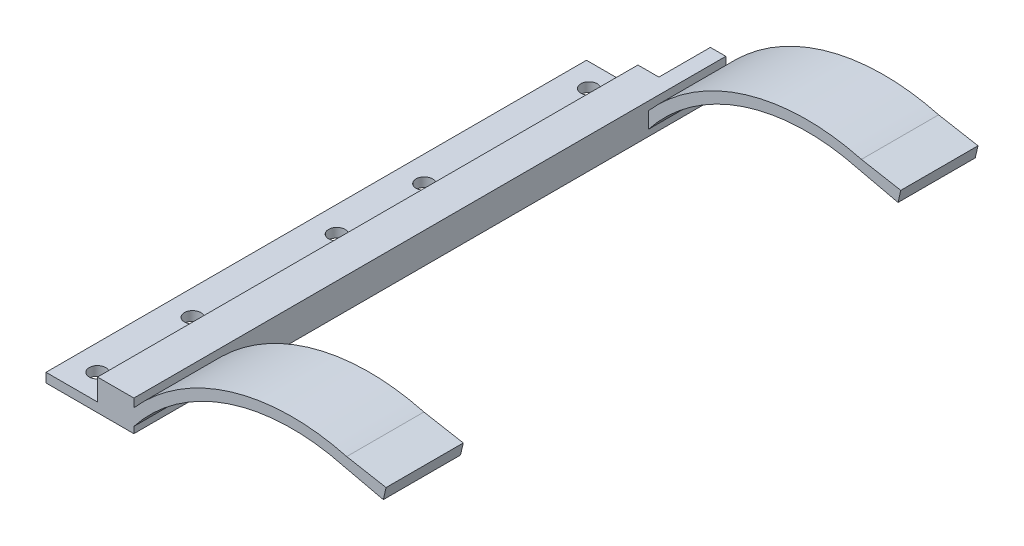
ISO-10303-21;
HEADER;
FILE_DESCRIPTION(('STEP AP214'),'2;1');
FILE_NAME('part.step','',(''),(''),'','','');
FILE_SCHEMA(('AUTOMOTIVE_DESIGN { 1 0 10303 214 1 1 1 1 }'));
ENDSEC;
DATA;
#1=APPLICATION_CONTEXT('core data for automotive mechanical design processes');
#2=APPLICATION_PROTOCOL_DEFINITION('international standard','automotive_design',2000,#1);
#3=PRODUCT_CONTEXT('',#1,'mechanical');
#4=PRODUCT('Part','Part','',(#3));
#5=PRODUCT_RELATED_PRODUCT_CATEGORY('part','',(#4));
#6=PRODUCT_DEFINITION_FORMATION('','',#4);
#7=PRODUCT_DEFINITION_CONTEXT('part definition',#1,'design');
#8=PRODUCT_DEFINITION('design','',#6,#7);
#9=PRODUCT_DEFINITION_SHAPE('','',#8);
#10=(LENGTH_UNIT() NAMED_UNIT(*) SI_UNIT(.MILLI.,.METRE.));
#11=(NAMED_UNIT(*) PLANE_ANGLE_UNIT() SI_UNIT($,.RADIAN.));
#12=(NAMED_UNIT(*) SI_UNIT($,.STERADIAN.) SOLID_ANGLE_UNIT());
#13=UNCERTAINTY_MEASURE_WITH_UNIT(LENGTH_MEASURE(1.E-05),#10,'distance_accuracy_value','');
#14=(GEOMETRIC_REPRESENTATION_CONTEXT(3) GLOBAL_UNCERTAINTY_ASSIGNED_CONTEXT((#13)) GLOBAL_UNIT_ASSIGNED_CONTEXT((#10,
#11,#12)) REPRESENTATION_CONTEXT('',''));
#15=CARTESIAN_POINT('',(0.,0.,0.));
#16=DIRECTION('',(0.,0.,1.));
#17=DIRECTION('',(1.,0.,0.));
#18=AXIS2_PLACEMENT_3D('',#15,#16,#17);
#19=CARTESIAN_POINT('',(69.3089995900447,-24.7748242791177,-115.));
#20=DIRECTION('',(0.,0.,1.));
#21=DIRECTION('',(-1.,0.,0.));
#22=AXIS2_PLACEMENT_3D('',#19,#20,#21);
#23=CYLINDRICAL_SURFACE('',#22,41.);
#24=DIRECTION('',(0.,0.,1.));
#25=VECTOR('',#24,1.);
#26=CARTESIAN_POINT('',(79.9205804392479,14.8281345987342,-115.));
#27=LINE('',#26,#25);
#28=CARTESIAN_POINT('',(79.9205804392479,14.8281345987342,-115.));
#29=VERTEX_POINT('',#28);
#30=CARTESIAN_POINT('',(79.9205804392479,14.8281345987342,-100.));
#31=VERTEX_POINT('',#30);
#32=EDGE_CURVE('E219',#29,#31,#27,.T.);
#33=ORIENTED_EDGE('',*,*,#32,.F.);
#34=CARTESIAN_POINT('',(69.3089995900447,-24.7748242791177,-115.));
#35=DIRECTION('',(0.,0.,-1.));
#36=DIRECTION('',(-1.,0.,0.));
#37=AXIS2_PLACEMENT_3D('',#34,#35,#36);
#38=CIRCLE('',#37,41.);
#39=CARTESIAN_POINT('',(38.5710678118655,2.35780460199148,-115.));
#40=VERTEX_POINT('',#39);
#41=EDGE_CURVE('E349',#40,#29,#38,.T.);
#42=ORIENTED_EDGE('',*,*,#41,.F.);
#43=DIRECTION('',(0.,0.,1.));
#44=VECTOR('',#43,1.);
#45=CARTESIAN_POINT('',(38.5710678118655,2.35780460199148,-115.));
#46=LINE('',#45,#44);
#47=CARTESIAN_POINT('',(38.5710678118655,2.35780460199148,-100.));
#48=VERTEX_POINT('',#47);
#49=EDGE_CURVE('E224',#40,#48,#46,.T.);
#50=ORIENTED_EDGE('',*,*,#49,.T.);
#51=CARTESIAN_POINT('',(69.3089995900447,-24.7748242791177,-100.));
#52=DIRECTION('',(0.,0.,-1.));
#53=DIRECTION('',(-1.,0.,0.));
#54=AXIS2_PLACEMENT_3D('',#51,#52,#53);
#55=CIRCLE('',#54,41.);
#56=EDGE_CURVE('E380',#31,#48,#55,.F.);
#57=ORIENTED_EDGE('',*,*,#56,.F.);
#58=EDGE_LOOP('',(#33,#42,#50,#57));
#59=FACE_BOUND('',#58,.T.);
#60=ADVANCED_FACE('F44',(#59),#23,.T.);
#61=CARTESIAN_POINT('',(38.5710678118655,2.35780460199148,-15.));
#62=VERTEX_POINT('',#61);
#63=CARTESIAN_POINT('',(38.5710678118655,2.35780460199148,0.));
#64=VERTEX_POINT('',#63);
#65=EDGE_CURVE('E189',#62,#64,#46,.T.);
#66=ORIENTED_EDGE('',*,*,#65,.T.);
#67=CARTESIAN_POINT('',(69.3089995900447,-24.7748242791177,0.));
#68=DIRECTION('',(0.,0.,-1.));
#69=DIRECTION('',(-1.,0.,0.));
#70=AXIS2_PLACEMENT_3D('',#67,#68,#69);
#71=CIRCLE('',#70,41.);
#72=CARTESIAN_POINT('',(79.9205804392479,14.8281345987342,0.));
#73=VERTEX_POINT('',#72);
#74=EDGE_CURVE('E350',#64,#73,#71,.T.);
#75=ORIENTED_EDGE('',*,*,#74,.T.);
#76=CARTESIAN_POINT('',(79.9205804392479,14.8281345987342,-15.));
#77=VERTEX_POINT('',#76);
#78=EDGE_CURVE('E216',#77,#73,#27,.T.);
#79=ORIENTED_EDGE('',*,*,#78,.F.);
#80=CARTESIAN_POINT('',(69.3089995900447,-24.7748242791177,-15.));
#81=DIRECTION('',(0.,0.,1.));
#82=DIRECTION('',(1.,0.,0.));
#83=AXIS2_PLACEMENT_3D('',#80,#81,#82);
#84=CIRCLE('',#83,41.);
#85=EDGE_CURVE('E201',#62,#77,#84,.F.);
#86=ORIENTED_EDGE('',*,*,#85,.F.);
#87=EDGE_LOOP('',(#66,#75,#79,#86));
#88=FACE_BOUND('',#87,.T.);
#89=ADVANCED_FACE('F363',(#88),#23,.T.);
#90=CARTESIAN_POINT('',(69.3089995900447,-24.7748242791177,-115.));
#91=DIRECTION('',(0.,0.,1.));
#92=DIRECTION('',(-1.,0.,0.));
#93=AXIS2_PLACEMENT_3D('',#90,#91,#92);
#94=CYLINDRICAL_SURFACE('',#93,39.);
#95=DIRECTION('',(0.,0.,1.));
#96=VECTOR('',#95,1.);
#97=CARTESIAN_POINT('',(38.5710678118655,-0.771083945577997,-115.));
#98=LINE('',#97,#96);
#99=CARTESIAN_POINT('',(38.5710678118655,-0.771083945577997,-115.));
#100=VERTEX_POINT('',#99);
#101=CARTESIAN_POINT('',(38.5710678118655,-0.771083945578,-100.));
#102=VERTEX_POINT('',#101);
#103=EDGE_CURVE('E207',#100,#102,#98,.T.);
#104=ORIENTED_EDGE('',*,*,#103,.F.);
#105=CARTESIAN_POINT('',(69.3089995900447,-24.7748242791177,-115.));
#106=DIRECTION('',(0.,0.,1.));
#107=DIRECTION('',(-1.,0.,0.));
#108=AXIS2_PLACEMENT_3D('',#105,#106,#107);
#109=CIRCLE('',#108,39.);
#110=CARTESIAN_POINT('',(79.4029423490428,12.896282946156,-115.));
#111=VERTEX_POINT('',#110);
#112=EDGE_CURVE('E404',#111,#100,#109,.T.);
#113=ORIENTED_EDGE('',*,*,#112,.F.);
#114=DIRECTION('',(0.,0.,1.));
#115=VECTOR('',#114,1.);
#116=CARTESIAN_POINT('',(79.4029423490428,12.896282946156,-115.));
#117=LINE('',#116,#115);
#118=CARTESIAN_POINT('',(79.4029423490428,12.896282946156,-100.));
#119=VERTEX_POINT('',#118);
#120=EDGE_CURVE('E210',#111,#119,#117,.T.);
#121=ORIENTED_EDGE('',*,*,#120,.T.);
#122=CARTESIAN_POINT('',(69.3089995900447,-24.7748242791177,-100.));
#123=DIRECTION('',(0.,0.,-1.));
#124=DIRECTION('',(-1.,0.,0.));
#125=AXIS2_PLACEMENT_3D('',#122,#123,#124);
#126=CIRCLE('',#125,39.);
#127=EDGE_CURVE('E372',#102,#119,#126,.T.);
#128=ORIENTED_EDGE('',*,*,#127,.F.);
#129=EDGE_LOOP('',(#104,#113,#121,#128));
#130=FACE_BOUND('',#129,.T.);
#131=ADVANCED_FACE('F434',(#130),#94,.F.);
#132=CARTESIAN_POINT('',(79.4029423490428,12.896282946156,-15.));
#133=VERTEX_POINT('',#132);
#134=CARTESIAN_POINT('',(79.4029423490428,12.896282946156,0.));
#135=VERTEX_POINT('',#134);
#136=EDGE_CURVE('E215',#133,#135,#117,.T.);
#137=ORIENTED_EDGE('',*,*,#136,.T.);
#138=CARTESIAN_POINT('',(69.3089995900447,-24.7748242791177,0.));
#139=DIRECTION('',(0.,0.,1.));
#140=DIRECTION('',(-1.,0.,0.));
#141=AXIS2_PLACEMENT_3D('',#138,#139,#140);
#142=CIRCLE('',#141,39.);
#143=CARTESIAN_POINT('',(38.5710678118655,-0.771083945577997,0.));
#144=VERTEX_POINT('',#143);
#145=EDGE_CURVE('E204',#135,#144,#142,.T.);
#146=ORIENTED_EDGE('',*,*,#145,.T.);
#147=CARTESIAN_POINT('',(38.5710678118655,-0.771083945578,-15.));
#148=VERTEX_POINT('',#147);
#149=EDGE_CURVE('E184',#148,#144,#98,.T.);
#150=ORIENTED_EDGE('',*,*,#149,.F.);
#151=CARTESIAN_POINT('',(69.3089995900447,-24.7748242791177,-15.));
#152=DIRECTION('',(0.,0.,1.));
#153=DIRECTION('',(1.,0.,0.));
#154=AXIS2_PLACEMENT_3D('',#151,#152,#153);
#155=CIRCLE('',#154,39.);
#156=EDGE_CURVE('E193',#133,#148,#155,.T.);
#157=ORIENTED_EDGE('',*,*,#156,.F.);
#158=EDGE_LOOP('',(#137,#146,#150,#157));
#159=FACE_BOUND('',#158,.T.);
#160=ADVANCED_FACE('F203',(#159),#94,.F.);
#161=CARTESIAN_POINT('',(79.4029423490428,12.896282946156,-123.959348420164));
#162=DIRECTION('',(-0.224454230988012,-0.974484632096156,0.));
#163=DIRECTION('',(0.974484632096156,-0.224454230988012,0.));
#164=AXIS2_PLACEMENT_3D('',#161,#162,#163);
#165=PLANE('',#164);
#166=ORIENTED_EDGE('',*,*,#120,.F.);
#167=DIRECTION('',(0.974484632096156,-0.224454230988012,0.));
#168=VECTOR('',#167,1.);
#169=CARTESIAN_POINT('',(79.4029423490428,12.896282946156,-115.));
#170=LINE('',#169,#168);
#171=CARTESIAN_POINT('',(87.0361098105124,11.1381261973097,-115.));
#172=VERTEX_POINT('',#171);
#173=EDGE_CURVE('E381',#111,#172,#170,.T.);
#174=ORIENTED_EDGE('',*,*,#173,.T.);
#175=DIRECTION('',(0.,0.,1.));
#176=VECTOR('',#175,1.);
#177=CARTESIAN_POINT('',(87.0361098105124,11.1381261973097,-123.959348420164));
#178=LINE('',#177,#176);
#179=CARTESIAN_POINT('',(87.0361098105124,11.1381261973097,-100.));
#180=VERTEX_POINT('',#179);
#181=EDGE_CURVE('E383',#172,#180,#178,.T.);
#182=ORIENTED_EDGE('',*,*,#181,.T.);
#183=DIRECTION('',(0.974484632096156,-0.224454230988012,0.));
#184=VECTOR('',#183,1.);
#185=CARTESIAN_POINT('',(79.4029423490428,12.896282946156,-100.));
#186=LINE('',#185,#184);
#187=EDGE_CURVE('E368',#119,#180,#186,.T.);
#188=ORIENTED_EDGE('',*,*,#187,.F.);
#189=EDGE_LOOP('',(#166,#174,#182,#188));
#190=FACE_BOUND('',#189,.T.);
#191=ADVANCED_FACE('F441',(#190),#165,.T.);
#192=CARTESIAN_POINT('',(87.0361098105124,11.1381261973097,-15.));
#193=VERTEX_POINT('',#192);
#194=CARTESIAN_POINT('',(87.0361098105124,11.1381261973097,0.));
#195=VERTEX_POINT('',#194);
#196=EDGE_CURVE('E400',#193,#195,#178,.T.);
#197=ORIENTED_EDGE('',*,*,#196,.T.);
#198=DIRECTION('',(-0.974484632096156,0.224454230988012,0.));
#199=VECTOR('',#198,1.);
#200=CARTESIAN_POINT('',(79.4029423490428,12.896282946156,0.));
#201=LINE('',#200,#199);
#202=EDGE_CURVE('E394',#195,#135,#201,.T.);
#203=ORIENTED_EDGE('',*,*,#202,.T.);
#204=ORIENTED_EDGE('',*,*,#136,.F.);
#205=DIRECTION('',(-0.974484632096156,0.224454230988012,0.));
#206=VECTOR('',#205,1.);
#207=CARTESIAN_POINT('',(79.4029423490428,12.896282946156,-15.));
#208=LINE('',#207,#206);
#209=EDGE_CURVE('E199',#193,#133,#208,.T.);
#210=ORIENTED_EDGE('',*,*,#209,.F.);
#211=EDGE_LOOP('',(#197,#203,#204,#210));
#212=FACE_BOUND('',#211,.T.);
#213=ADVANCED_FACE('F519',(#212),#165,.T.);
#214=CARTESIAN_POINT('',(87.5671178806759,13.4435369780092,-123.959348420164));
#215=DIRECTION('',(0.974484632096156,-0.224454230988012,0.));
#216=DIRECTION('',(0.224454230988012,0.974484632096156,0.));
#217=AXIS2_PLACEMENT_3D('',#214,#215,#216);
#218=PLANE('',#217);
#219=ORIENTED_EDGE('',*,*,#181,.F.);
#220=DIRECTION('',(0.224454230988012,0.974484632096156,0.));
#221=VECTOR('',#220,1.);
#222=CARTESIAN_POINT('',(87.5671178806759,13.4435369780092,-115.));
#223=LINE('',#222,#221);
#224=CARTESIAN_POINT('',(87.5671178806759,13.4435369780092,-115.));
#225=VERTEX_POINT('',#224);
#226=EDGE_CURVE('E382',#172,#225,#223,.T.);
#227=ORIENTED_EDGE('',*,*,#226,.T.);
#228=DIRECTION('',(0.,0.,1.));
#229=VECTOR('',#228,1.);
#230=CARTESIAN_POINT('',(87.5671178806759,13.4435369780092,-123.959348420164));
#231=LINE('',#230,#229);
#232=CARTESIAN_POINT('',(87.5671178806759,13.4435369780092,-100.));
#233=VERTEX_POINT('',#232);
#234=EDGE_CURVE('E398',#225,#233,#231,.T.);
#235=ORIENTED_EDGE('',*,*,#234,.T.);
#236=DIRECTION('',(0.224454230988012,0.974484632096156,0.));
#237=VECTOR('',#236,1.);
#238=CARTESIAN_POINT('',(87.5671178806759,13.4435369780092,-100.));
#239=LINE('',#238,#237);
#240=EDGE_CURVE('E362',#180,#233,#239,.T.);
#241=ORIENTED_EDGE('',*,*,#240,.F.);
#242=EDGE_LOOP('',(#219,#227,#235,#241));
#243=FACE_BOUND('',#242,.T.);
#244=ADVANCED_FACE('F443',(#243),#218,.T.);
#245=CARTESIAN_POINT('',(87.5671178806759,13.4435369780092,-15.));
#246=VERTEX_POINT('',#245);
#247=CARTESIAN_POINT('',(87.5671178806759,13.4435369780092,0.));
#248=VERTEX_POINT('',#247);
#249=EDGE_CURVE('E395',#246,#248,#231,.T.);
#250=ORIENTED_EDGE('',*,*,#249,.T.);
#251=DIRECTION('',(-0.224454230988012,-0.974484632096156,0.));
#252=VECTOR('',#251,1.);
#253=CARTESIAN_POINT('',(87.5671178806759,13.4435369780092,0.));
#254=LINE('',#253,#252);
#255=EDGE_CURVE('E389',#248,#195,#254,.T.);
#256=ORIENTED_EDGE('',*,*,#255,.T.);
#257=ORIENTED_EDGE('',*,*,#196,.F.);
#258=DIRECTION('',(-0.224454230988012,-0.974484632096156,0.));
#259=VECTOR('',#258,1.);
#260=CARTESIAN_POINT('',(87.5671178806759,13.4435369780092,-15.));
#261=LINE('',#260,#259);
#262=EDGE_CURVE('E188',#246,#193,#261,.T.);
#263=ORIENTED_EDGE('',*,*,#262,.F.);
#264=EDGE_LOOP('',(#250,#256,#257,#263));
#265=FACE_BOUND('',#264,.T.);
#266=ADVANCED_FACE('F425',(#265),#218,.T.);
#267=CARTESIAN_POINT('',(79.9205804392479,14.8281345987342,-123.959348420164));
#268=DIRECTION('',(0.178177609824559,0.983998343167918,0.));
#269=DIRECTION('',(-0.983998343167918,0.178177609824559,0.));
#270=AXIS2_PLACEMENT_3D('',#267,#268,#269);
#271=PLANE('',#270);
#272=ORIENTED_EDGE('',*,*,#234,.F.);
#273=DIRECTION('',(-0.983998343167918,0.178177609824559,0.));
#274=VECTOR('',#273,1.);
#275=CARTESIAN_POINT('',(79.9205804392479,14.8281345987342,-115.));
#276=LINE('',#275,#274);
#277=EDGE_CURVE('E387',#225,#29,#276,.T.);
#278=ORIENTED_EDGE('',*,*,#277,.T.);
#279=ORIENTED_EDGE('',*,*,#32,.T.);
#280=DIRECTION('',(-0.983998343167918,0.178177609824559,0.));
#281=VECTOR('',#280,1.);
#282=CARTESIAN_POINT('',(79.9205804392479,14.8281345987342,-100.));
#283=LINE('',#282,#281);
#284=EDGE_CURVE('E11',#233,#31,#283,.T.);
#285=ORIENTED_EDGE('',*,*,#284,.F.);
#286=EDGE_LOOP('',(#272,#278,#279,#285));
#287=FACE_BOUND('',#286,.T.);
#288=ADVANCED_FACE('F447',(#287),#271,.T.);
#289=ORIENTED_EDGE('',*,*,#78,.T.);
#290=DIRECTION('',(0.983998343167918,-0.178177609824559,0.));
#291=VECTOR('',#290,1.);
#292=CARTESIAN_POINT('',(79.9205804392479,14.8281345987342,0.));
#293=LINE('',#292,#291);
#294=EDGE_CURVE('E379',#73,#248,#293,.T.);
#295=ORIENTED_EDGE('',*,*,#294,.T.);
#296=ORIENTED_EDGE('',*,*,#249,.F.);
#297=DIRECTION('',(0.983998343167918,-0.178177609824559,0.));
#298=VECTOR('',#297,1.);
#299=CARTESIAN_POINT('',(79.9205804392479,14.8281345987342,-15.));
#300=LINE('',#299,#298);
#301=EDGE_CURVE('E52',#77,#246,#300,.T.);
#302=ORIENTED_EDGE('',*,*,#301,.F.);
#303=EDGE_LOOP('',(#289,#295,#296,#302));
#304=FACE_BOUND('',#303,.T.);
#305=ADVANCED_FACE('F417',(#304),#271,.T.);
#306=CARTESIAN_POINT('',(31.5,4.,-1.94289029309402E-13));
#307=DIRECTION('',(0.,1.,0.));
#308=DIRECTION('',(0.,0.,1.));
#309=AXIS2_PLACEMENT_3D('',#306,#307,#308);
#310=PLANE('',#309);
#311=DIRECTION('',(-1.,0.,0.));
#312=VECTOR('',#311,1.);
#313=CARTESIAN_POINT('',(31.5,4.,-105.));
#314=LINE('',#313,#312);
#315=CARTESIAN_POINT('',(35.5710678118655,4.,-105.));
#316=VERTEX_POINT('',#315);
#317=CARTESIAN_POINT('',(31.5,4.,-105.));
#318=VERTEX_POINT('',#317);
#319=EDGE_CURVE('E250',#316,#318,#314,.T.);
#320=ORIENTED_EDGE('',*,*,#319,.T.);
#321=DIRECTION('',(0.,0.,-1.));
#322=VECTOR('',#321,1.);
#323=CARTESIAN_POINT('',(31.5,4.,48.0000000000001));
#324=LINE('',#323,#322);
#325=CARTESIAN_POINT('',(31.5,4.,-1.94289029309402E-13));
#326=VERTEX_POINT('',#325);
#327=EDGE_CURVE('E221',#326,#318,#324,.T.);
#328=ORIENTED_EDGE('',*,*,#327,.F.);
#329=DIRECTION('',(1.,0.,0.));
#330=VECTOR('',#329,1.);
#331=CARTESIAN_POINT('',(31.5,4.,-1.94289029309402E-13));
#332=LINE('',#331,#330);
#333=CARTESIAN_POINT('',(38.5710678118655,4.,0.));
#334=VERTEX_POINT('',#333);
#335=EDGE_CURVE('E268',#326,#334,#332,.T.);
#336=ORIENTED_EDGE('',*,*,#335,.T.);
#337=DIRECTION('',(0.,0.,1.));
#338=VECTOR('',#337,1.);
#339=CARTESIAN_POINT('',(38.5710678118655,4.,-115.));
#340=LINE('',#339,#338);
#341=CARTESIAN_POINT('',(38.5710678118655,4.,-115.));
#342=VERTEX_POINT('',#341);
#343=EDGE_CURVE('E354',#342,#334,#340,.T.);
#344=ORIENTED_EDGE('',*,*,#343,.F.);
#345=DIRECTION('',(1.,0.,0.));
#346=VECTOR('',#345,1.);
#347=CARTESIAN_POINT('',(35.5710678118655,4.,-115.));
#348=LINE('',#347,#346);
#349=CARTESIAN_POINT('',(35.5710678118655,4.,-115.));
#350=VERTEX_POINT('',#349);
#351=EDGE_CURVE('E414',#350,#342,#348,.T.);
#352=ORIENTED_EDGE('',*,*,#351,.F.);
#353=DIRECTION('',(0.,0.,1.));
#354=VECTOR('',#353,1.);
#355=CARTESIAN_POINT('',(35.5710678118655,4.,-115.));
#356=LINE('',#355,#354);
#357=EDGE_CURVE('E331',#350,#316,#356,.T.);
#358=ORIENTED_EDGE('',*,*,#357,.T.);
#359=EDGE_LOOP('',(#320,#328,#336,#344,#352,#358));
#360=FACE_BOUND('',#359,.T.);
#361=ADVANCED_FACE('F327',(#360),#310,.T.);
#362=CARTESIAN_POINT('',(0.,2.,0.));
#363=DIRECTION('',(0.,0.,-1.));
#364=DIRECTION('',(-1.,0.,0.));
#365=AXIS2_PLACEMENT_3D('',#362,#363,#364);
#366=PLANE('',#365);
#367=ORIENTED_EDGE('',*,*,#335,.F.);
#368=DIRECTION('',(0.,-1.,0.));
#369=VECTOR('',#368,1.);
#370=CARTESIAN_POINT('',(31.5,2.,0.));
#371=LINE('',#370,#369);
#372=CARTESIAN_POINT('',(31.5,-0.20000000000001,-1.94289029309402E-13));
#373=VERTEX_POINT('',#372);
#374=EDGE_CURVE('E274',#326,#373,#371,.T.);
#375=ORIENTED_EDGE('',*,*,#374,.T.);
#376=DIRECTION('',(1.,0.,0.));
#377=VECTOR('',#376,1.);
#378=CARTESIAN_POINT('',(21.5,-0.20000000000001,-1.94289029309402E-13));
#379=LINE('',#378,#377);
#380=CARTESIAN_POINT('',(21.5,-0.20000000000001,-1.94289029309402E-13));
#381=VERTEX_POINT('',#380);
#382=EDGE_CURVE('E262',#381,#373,#379,.T.);
#383=ORIENTED_EDGE('',*,*,#382,.F.);
#384=DIRECTION('',(0.,1.,0.));
#385=VECTOR('',#384,1.);
#386=CARTESIAN_POINT('',(21.5,-0.20000000000001,-1.94289029309402E-13));
#387=LINE('',#386,#385);
#388=CARTESIAN_POINT('',(21.5,-2.,-1.94289029309402E-13));
#389=VERTEX_POINT('',#388);
#390=EDGE_CURVE('E257',#389,#381,#387,.T.);
#391=ORIENTED_EDGE('',*,*,#390,.F.);
#392=DIRECTION('',(-1.,0.,0.));
#393=VECTOR('',#392,1.);
#394=CARTESIAN_POINT('',(35.5710678118655,-2.,-1.94289029309402E-13));
#395=LINE('',#394,#393);
#396=CARTESIAN_POINT('',(38.5710678118655,-2.,0.));
#397=VERTEX_POINT('',#396);
#398=EDGE_CURVE('E272',#397,#389,#395,.T.);
#399=ORIENTED_EDGE('',*,*,#398,.F.);
#400=DIRECTION('',(0.,-1.,0.));
#401=VECTOR('',#400,1.);
#402=CARTESIAN_POINT('',(38.5710678118655,-0.771083945577997,0.));
#403=LINE('',#402,#401);
#404=EDGE_CURVE('E342',#144,#397,#403,.T.);
#405=ORIENTED_EDGE('',*,*,#404,.F.);
#406=ORIENTED_EDGE('',*,*,#145,.F.);
#407=ORIENTED_EDGE('',*,*,#202,.F.);
#408=ORIENTED_EDGE('',*,*,#255,.F.);
#409=ORIENTED_EDGE('',*,*,#294,.F.);
#410=ORIENTED_EDGE('',*,*,#74,.F.);
#411=DIRECTION('',(0.,-1.,0.));
#412=VECTOR('',#411,1.);
#413=CARTESIAN_POINT('',(38.5710678118655,4.,0.));
#414=LINE('',#413,#412);
#415=EDGE_CURVE('E344',#334,#64,#414,.T.);
#416=ORIENTED_EDGE('',*,*,#415,.F.);
#417=EDGE_LOOP('',(#367,#375,#383,#391,#399,#405,#406,#407,#408,#409,#410,#416));
#418=FACE_BOUND('',#417,.T.);
#419=ADVANCED_FACE('F50',(#418),#366,.F.);
#420=CARTESIAN_POINT('',(31.5,2.,326.5));
#421=DIRECTION('',(1.,0.,0.));
#422=DIRECTION('',(0.,0.,-1.));
#423=AXIS2_PLACEMENT_3D('',#420,#421,#422);
#424=PLANE('',#423);
#425=DIRECTION('',(0.,1.,0.));
#426=VECTOR('',#425,1.);
#427=CARTESIAN_POINT('',(31.5,2.,-105.));
#428=LINE('',#427,#426);
#429=CARTESIAN_POINT('',(31.5,-0.20000000000001,-105.));
#430=VERTEX_POINT('',#429);
#431=EDGE_CURVE('E244',#430,#318,#428,.T.);
#432=ORIENTED_EDGE('',*,*,#431,.F.);
#433=DIRECTION('',(0.,0.,-1.));
#434=VECTOR('',#433,1.);
#435=CARTESIAN_POINT('',(31.5,-0.20000000000001,-110.));
#436=LINE('',#435,#434);
#437=EDGE_CURVE('E253',#373,#430,#436,.T.);
#438=ORIENTED_EDGE('',*,*,#437,.F.);
#439=ORIENTED_EDGE('',*,*,#374,.F.);
#440=ORIENTED_EDGE('',*,*,#327,.T.);
#441=EDGE_LOOP('',(#432,#438,#439,#440));
#442=FACE_BOUND('',#441,.T.);
#443=ADVANCED_FACE('F324',(#442),#424,.F.);
#444=CARTESIAN_POINT('',(35.5710678118655,-2.,-1.94289029309402E-13));
#445=DIRECTION('',(0.,-1.,0.));
#446=DIRECTION('',(0.,0.,-1.));
#447=AXIS2_PLACEMENT_3D('',#444,#445,#446);
#448=PLANE('',#447);
#449=DIRECTION('',(0.,0.,1.));
#450=VECTOR('',#449,1.);
#451=CARTESIAN_POINT('',(21.5,-2.,-1.94289029309402E-13));
#452=LINE('',#451,#450);
#453=CARTESIAN_POINT('',(21.5,-2.,-105.));
#454=VERTEX_POINT('',#453);
#455=EDGE_CURVE('E256',#454,#389,#452,.T.);
#456=ORIENTED_EDGE('',*,*,#455,.F.);
#457=DIRECTION('',(1.,0.,0.));
#458=VECTOR('',#457,1.);
#459=CARTESIAN_POINT('',(35.5710678118655,-2.,-105.));
#460=LINE('',#459,#458);
#461=CARTESIAN_POINT('',(35.5710678118655,-2.,-105.));
#462=VERTEX_POINT('',#461);
#463=EDGE_CURVE('E255',#454,#462,#460,.T.);
#464=ORIENTED_EDGE('',*,*,#463,.T.);
#465=DIRECTION('',(0.,0.,1.));
#466=VECTOR('',#465,1.);
#467=CARTESIAN_POINT('',(35.5710678118655,-2.,-115.));
#468=LINE('',#467,#466);
#469=CARTESIAN_POINT('',(35.5710678118655,-2.,-115.));
#470=VERTEX_POINT('',#469);
#471=EDGE_CURVE('E334',#470,#462,#468,.T.);
#472=ORIENTED_EDGE('',*,*,#471,.F.);
#473=DIRECTION('',(-1.,0.,0.));
#474=VECTOR('',#473,1.);
#475=CARTESIAN_POINT('',(38.5710678118655,-2.,-115.));
#476=LINE('',#475,#474);
#477=CARTESIAN_POINT('',(38.5710678118655,-2.,-115.));
#478=VERTEX_POINT('',#477);
#479=EDGE_CURVE('E408',#478,#470,#476,.T.);
#480=ORIENTED_EDGE('',*,*,#479,.F.);
#481=DIRECTION('',(0.,0.,1.));
#482=VECTOR('',#481,1.);
#483=CARTESIAN_POINT('',(38.5710678118655,-2.,-115.));
#484=LINE('',#483,#482);
#485=EDGE_CURVE('E208',#478,#397,#484,.T.);
#486=ORIENTED_EDGE('',*,*,#485,.T.);
#487=ORIENTED_EDGE('',*,*,#398,.T.);
#488=EDGE_LOOP('',(#456,#464,#472,#480,#486,#487));
#489=FACE_BOUND('',#488,.T.);
#490=CARTESIAN_POINT('',(26.5,-2.,-68.5000000000002));
#491=DIRECTION('',(0.,-1.,0.));
#492=DIRECTION('',(0.,0.,-1.));
#493=AXIS2_PLACEMENT_3D('',#490,#491,#492);
#494=CIRCLE('',#493,1.60000000000001);
#495=CARTESIAN_POINT('',(26.5,-2.,-70.1000000000002));
#496=VERTEX_POINT('',#495);
#497=EDGE_CURVE('E233',#496,#496,#494,.T.);
#498=ORIENTED_EDGE('',*,*,#497,.F.);
#499=EDGE_LOOP('',(#498));
#500=FACE_BOUND('',#499,.T.);
#501=CARTESIAN_POINT('',(26.5,-2.,-100.5));
#502=DIRECTION('',(0.,-1.,0.));
#503=DIRECTION('',(0.,0.,-1.));
#504=AXIS2_PLACEMENT_3D('',#501,#502,#503);
#505=CIRCLE('',#504,1.60000000000001);
#506=CARTESIAN_POINT('',(26.5,-2.,-102.1));
#507=VERTEX_POINT('',#506);
#508=EDGE_CURVE('E228',#507,#507,#505,.T.);
#509=ORIENTED_EDGE('',*,*,#508,.F.);
#510=EDGE_LOOP('',(#509));
#511=FACE_BOUND('',#510,.T.);
#512=CARTESIAN_POINT('',(26.5,-2.,-51.5000000000002));
#513=DIRECTION('',(0.,-1.,0.));
#514=DIRECTION('',(0.,0.,-1.));
#515=AXIS2_PLACEMENT_3D('',#512,#513,#514);
#516=CIRCLE('',#515,1.6);
#517=CARTESIAN_POINT('',(26.5,-2.,-53.1000000000002));
#518=VERTEX_POINT('',#517);
#519=EDGE_CURVE('E222',#518,#518,#516,.F.);
#520=ORIENTED_EDGE('',*,*,#519,.T.);
#521=EDGE_LOOP('',(#520));
#522=FACE_BOUND('',#521,.T.);
#523=CARTESIAN_POINT('',(26.5,-2.,-5.00000000000019));
#524=DIRECTION('',(0.,-1.,0.));
#525=DIRECTION('',(0.,0.,-1.));
#526=AXIS2_PLACEMENT_3D('',#523,#524,#525);
#527=CIRCLE('',#526,1.6);
#528=CARTESIAN_POINT('',(26.5,-2.,-6.6000000000002));
#529=VERTEX_POINT('',#528);
#530=EDGE_CURVE('E239',#529,#529,#527,.T.);
#531=ORIENTED_EDGE('',*,*,#530,.F.);
#532=EDGE_LOOP('',(#531));
#533=FACE_BOUND('',#532,.T.);
#534=CARTESIAN_POINT('',(26.5,-2.,-23.5000000000002));
#535=DIRECTION('',(0.,-1.,0.));
#536=DIRECTION('',(0.,0.,-1.));
#537=AXIS2_PLACEMENT_3D('',#534,#535,#536);
#538=CIRCLE('',#537,1.6);
#539=CARTESIAN_POINT('',(26.5,-2.,-25.1000000000002));
#540=VERTEX_POINT('',#539);
#541=EDGE_CURVE('E232',#540,#540,#538,.T.);
#542=ORIENTED_EDGE('',*,*,#541,.F.);
#543=EDGE_LOOP('',(#542));
#544=FACE_BOUND('',#543,.T.);
#545=ADVANCED_FACE('F293',(#489,#500,#511,#522,#533,#544),#448,.T.);
#546=CARTESIAN_POINT('',(21.5,-0.20000000000001,-110.));
#547=DIRECTION('',(0.,-1.,0.));
#548=DIRECTION('',(0.,0.,-1.));
#549=AXIS2_PLACEMENT_3D('',#546,#547,#548);
#550=PLANE('',#549);
#551=CARTESIAN_POINT('',(26.5,-0.200000000000009,-5.00000000000019));
#552=DIRECTION('',(0.,-1.,0.));
#553=DIRECTION('',(0.,0.,-1.));
#554=AXIS2_PLACEMENT_3D('',#551,#552,#553);
#555=CIRCLE('',#554,1.6);
#556=CARTESIAN_POINT('',(26.5,-0.200000000000009,-6.6000000000002));
#557=VERTEX_POINT('',#556);
#558=EDGE_CURVE('E238',#557,#557,#555,.T.);
#559=ORIENTED_EDGE('',*,*,#558,.T.);
#560=EDGE_LOOP('',(#559));
#561=FACE_BOUND('',#560,.T.);
#562=CARTESIAN_POINT('',(26.5,-0.200000000000009,-23.5000000000002));
#563=DIRECTION('',(0.,-1.,0.));
#564=DIRECTION('',(0.,0.,-1.));
#565=AXIS2_PLACEMENT_3D('',#562,#563,#564);
#566=CIRCLE('',#565,1.6);
#567=CARTESIAN_POINT('',(26.5,-0.200000000000009,-25.1000000000002));
#568=VERTEX_POINT('',#567);
#569=EDGE_CURVE('E237',#568,#568,#566,.T.);
#570=ORIENTED_EDGE('',*,*,#569,.T.);
#571=EDGE_LOOP('',(#570));
#572=FACE_BOUND('',#571,.T.);
#573=CARTESIAN_POINT('',(26.5,-0.200000000000009,-51.5000000000002));
#574=DIRECTION('',(0.,-1.,0.));
#575=DIRECTION('',(0.,0.,-1.));
#576=AXIS2_PLACEMENT_3D('',#573,#574,#575);
#577=CIRCLE('',#576,1.6);
#578=CARTESIAN_POINT('',(26.5,-0.200000000000009,-53.1000000000002));
#579=VERTEX_POINT('',#578);
#580=EDGE_CURVE('E234',#579,#579,#577,.T.);
#581=ORIENTED_EDGE('',*,*,#580,.T.);
#582=EDGE_LOOP('',(#581));
#583=FACE_BOUND('',#582,.T.);
#584=CARTESIAN_POINT('',(26.5,-0.200000000000009,-68.5000000000002));
#585=DIRECTION('',(0.,-1.,0.));
#586=DIRECTION('',(0.,0.,-1.));
#587=AXIS2_PLACEMENT_3D('',#584,#585,#586);
#588=CIRCLE('',#587,1.60000000000001);
#589=CARTESIAN_POINT('',(26.5,-0.200000000000009,-70.1000000000002));
#590=VERTEX_POINT('',#589);
#591=EDGE_CURVE('E230',#590,#590,#588,.T.);
#592=ORIENTED_EDGE('',*,*,#591,.T.);
#593=EDGE_LOOP('',(#592));
#594=FACE_BOUND('',#593,.T.);
#595=CARTESIAN_POINT('',(26.5,-0.200000000000009,-100.5));
#596=DIRECTION('',(0.,-1.,0.));
#597=DIRECTION('',(0.,0.,-1.));
#598=AXIS2_PLACEMENT_3D('',#595,#596,#597);
#599=CIRCLE('',#598,1.60000000000001);
#600=CARTESIAN_POINT('',(26.5,-0.200000000000009,-102.1));
#601=VERTEX_POINT('',#600);
#602=EDGE_CURVE('E229',#601,#601,#599,.T.);
#603=ORIENTED_EDGE('',*,*,#602,.T.);
#604=EDGE_LOOP('',(#603));
#605=FACE_BOUND('',#604,.T.);
#606=DIRECTION('',(1.,0.,0.));
#607=VECTOR('',#606,1.);
#608=CARTESIAN_POINT('',(21.5,-0.20000000000001,-105.));
#609=LINE('',#608,#607);
#610=CARTESIAN_POINT('',(21.5,-0.200000000000009,-105.));
#611=VERTEX_POINT('',#610);
#612=EDGE_CURVE('E243',#611,#430,#609,.T.);
#613=ORIENTED_EDGE('',*,*,#612,.F.);
#614=DIRECTION('',(0.,0.,-1.));
#615=VECTOR('',#614,1.);
#616=CARTESIAN_POINT('',(21.5,-0.20000000000001,-110.));
#617=LINE('',#616,#615);
#618=EDGE_CURVE('E263',#381,#611,#617,.T.);
#619=ORIENTED_EDGE('',*,*,#618,.F.);
#620=ORIENTED_EDGE('',*,*,#382,.T.);
#621=ORIENTED_EDGE('',*,*,#437,.T.);
#622=EDGE_LOOP('',(#613,#619,#620,#621));
#623=FACE_BOUND('',#622,.T.);
#624=ADVANCED_FACE('F305',(#561,#572,#583,#594,#605,#623),#550,.F.);
#625=CARTESIAN_POINT('',(21.5,0.,0.));
#626=DIRECTION('',(1.,0.,0.));
#627=DIRECTION('',(0.,0.,-1.));
#628=AXIS2_PLACEMENT_3D('',#625,#626,#627);
#629=PLANE('',#628);
#630=ORIENTED_EDGE('',*,*,#390,.T.);
#631=ORIENTED_EDGE('',*,*,#618,.T.);
#632=DIRECTION('',(0.,1.,0.));
#633=VECTOR('',#632,1.);
#634=CARTESIAN_POINT('',(21.5,0.,-105.));
#635=LINE('',#634,#633);
#636=EDGE_CURVE('E69',#454,#611,#635,.T.);
#637=ORIENTED_EDGE('',*,*,#636,.F.);
#638=ORIENTED_EDGE('',*,*,#455,.T.);
#639=EDGE_LOOP('',(#630,#631,#637,#638));
#640=FACE_BOUND('',#639,.T.);
#641=ADVANCED_FACE('F304',(#640),#629,.F.);
#642=CARTESIAN_POINT('',(21.5,24.,-105.));
#643=DIRECTION('',(0.,0.,-1.));
#644=DIRECTION('',(-1.,0.,0.));
#645=AXIS2_PLACEMENT_3D('',#642,#643,#644);
#646=PLANE('',#645);
#647=DIRECTION('',(0.,1.,0.));
#648=VECTOR('',#647,1.);
#649=CARTESIAN_POINT('',(35.5710678118655,4.,-105.));
#650=LINE('',#649,#648);
#651=EDGE_CURVE('E249',#462,#316,#650,.T.);
#652=ORIENTED_EDGE('',*,*,#651,.F.);
#653=ORIENTED_EDGE('',*,*,#463,.F.);
#654=ORIENTED_EDGE('',*,*,#636,.T.);
#655=ORIENTED_EDGE('',*,*,#612,.T.);
#656=ORIENTED_EDGE('',*,*,#431,.T.);
#657=ORIENTED_EDGE('',*,*,#319,.F.);
#658=EDGE_LOOP('',(#652,#653,#654,#655,#656,#657));
#659=FACE_BOUND('',#658,.T.);
#660=ADVANCED_FACE('F314',(#659),#646,.T.);
#661=CARTESIAN_POINT('',(26.5,-16.,-100.5));
#662=DIRECTION('',(0.,1.,0.));
#663=DIRECTION('',(0.,0.,1.));
#664=AXIS2_PLACEMENT_3D('',#661,#662,#663);
#665=CYLINDRICAL_SURFACE('',#664,1.60000000000001);
#666=ORIENTED_EDGE('',*,*,#508,.T.);
#667=EDGE_LOOP('',(#666));
#668=FACE_BOUND('',#667,.T.);
#669=ORIENTED_EDGE('',*,*,#602,.F.);
#670=EDGE_LOOP('',(#669));
#671=FACE_BOUND('',#670,.T.);
#672=ADVANCED_FACE('F470',(#668,#671),#665,.F.);
#673=CARTESIAN_POINT('',(26.5,-16.,-68.5000000000002));
#674=DIRECTION('',(0.,1.,0.));
#675=DIRECTION('',(0.,0.,1.));
#676=AXIS2_PLACEMENT_3D('',#673,#674,#675);
#677=CYLINDRICAL_SURFACE('',#676,1.60000000000001);
#678=ORIENTED_EDGE('',*,*,#497,.T.);
#679=EDGE_LOOP('',(#678));
#680=FACE_BOUND('',#679,.T.);
#681=ORIENTED_EDGE('',*,*,#591,.F.);
#682=EDGE_LOOP('',(#681));
#683=FACE_BOUND('',#682,.T.);
#684=ADVANCED_FACE('F296',(#680,#683),#677,.F.);
#685=CARTESIAN_POINT('',(26.5,-16.,-51.5000000000002));
#686=DIRECTION('',(0.,1.,0.));
#687=DIRECTION('',(0.,0.,1.));
#688=AXIS2_PLACEMENT_3D('',#685,#686,#687);
#689=CYLINDRICAL_SURFACE('',#688,1.6);
#690=ORIENTED_EDGE('',*,*,#519,.F.);
#691=EDGE_LOOP('',(#690));
#692=FACE_BOUND('',#691,.T.);
#693=ORIENTED_EDGE('',*,*,#580,.F.);
#694=EDGE_LOOP('',(#693));
#695=FACE_BOUND('',#694,.T.);
#696=ADVANCED_FACE('F295',(#692,#695),#689,.F.);
#697=CARTESIAN_POINT('',(26.5,-16.,-23.5000000000002));
#698=DIRECTION('',(0.,1.,0.));
#699=DIRECTION('',(0.,0.,1.));
#700=AXIS2_PLACEMENT_3D('',#697,#698,#699);
#701=CYLINDRICAL_SURFACE('',#700,1.6);
#702=ORIENTED_EDGE('',*,*,#541,.T.);
#703=EDGE_LOOP('',(#702));
#704=FACE_BOUND('',#703,.T.);
#705=ORIENTED_EDGE('',*,*,#569,.F.);
#706=EDGE_LOOP('',(#705));
#707=FACE_BOUND('',#706,.T.);
#708=ADVANCED_FACE('F300',(#704,#707),#701,.F.);
#709=CARTESIAN_POINT('',(26.5,-16.,-5.00000000000019));
#710=DIRECTION('',(0.,1.,0.));
#711=DIRECTION('',(0.,0.,1.));
#712=AXIS2_PLACEMENT_3D('',#709,#710,#711);
#713=CYLINDRICAL_SURFACE('',#712,1.6);
#714=ORIENTED_EDGE('',*,*,#530,.T.);
#715=EDGE_LOOP('',(#714));
#716=FACE_BOUND('',#715,.T.);
#717=ORIENTED_EDGE('',*,*,#558,.F.);
#718=EDGE_LOOP('',(#717));
#719=FACE_BOUND('',#718,.T.);
#720=ADVANCED_FACE('F457',(#716,#719),#713,.F.);
#721=CARTESIAN_POINT('',(35.5710678118655,-2.,-115.));
#722=DIRECTION('',(-1.,0.,0.));
#723=DIRECTION('',(0.,0.,-1.));
#724=AXIS2_PLACEMENT_3D('',#721,#722,#723);
#725=PLANE('',#724);
#726=ORIENTED_EDGE('',*,*,#651,.T.);
#727=ORIENTED_EDGE('',*,*,#357,.F.);
#728=DIRECTION('',(0.,1.,0.));
#729=VECTOR('',#728,1.);
#730=CARTESIAN_POINT('',(35.5710678118655,-2.,-115.));
#731=LINE('',#730,#729);
#732=EDGE_CURVE('E340',#470,#350,#731,.T.);
#733=ORIENTED_EDGE('',*,*,#732,.F.);
#734=ORIENTED_EDGE('',*,*,#471,.T.);
#735=EDGE_LOOP('',(#726,#727,#733,#734));
#736=FACE_BOUND('',#735,.T.);
#737=ADVANCED_FACE('F337',(#736),#725,.T.);
#738=CARTESIAN_POINT('',(38.5710678118655,4.,-115.));
#739=DIRECTION('',(1.,0.,0.));
#740=DIRECTION('',(0.,0.,1.));
#741=AXIS2_PLACEMENT_3D('',#738,#739,#740);
#742=PLANE('',#741);
#743=ORIENTED_EDGE('',*,*,#415,.T.);
#744=ORIENTED_EDGE('',*,*,#65,.F.);
#745=DIRECTION('',(0.,1.,0.));
#746=VECTOR('',#745,1.);
#747=CARTESIAN_POINT('',(38.5710678118655,-2.,-15.));
#748=LINE('',#747,#746);
#749=EDGE_CURVE('E179',#148,#62,#748,.T.);
#750=ORIENTED_EDGE('',*,*,#749,.F.);
#751=ORIENTED_EDGE('',*,*,#149,.T.);
#752=ORIENTED_EDGE('',*,*,#404,.T.);
#753=ORIENTED_EDGE('',*,*,#485,.F.);
#754=DIRECTION('',(0.,-1.,0.));
#755=VECTOR('',#754,1.);
#756=CARTESIAN_POINT('',(38.5710678118655,-0.771083945577997,-115.));
#757=LINE('',#756,#755);
#758=EDGE_CURVE('E410',#100,#478,#757,.T.);
#759=ORIENTED_EDGE('',*,*,#758,.F.);
#760=ORIENTED_EDGE('',*,*,#103,.T.);
#761=DIRECTION('',(0.,-1.,0.));
#762=VECTOR('',#761,1.);
#763=CARTESIAN_POINT('',(38.5710678118655,-2.,-100.));
#764=LINE('',#763,#762);
#765=EDGE_CURVE('E191',#48,#102,#764,.T.);
#766=ORIENTED_EDGE('',*,*,#765,.F.);
#767=ORIENTED_EDGE('',*,*,#49,.F.);
#768=DIRECTION('',(0.,-1.,0.));
#769=VECTOR('',#768,1.);
#770=CARTESIAN_POINT('',(38.5710678118655,4.,-115.));
#771=LINE('',#770,#769);
#772=EDGE_CURVE('E411',#342,#40,#771,.T.);
#773=ORIENTED_EDGE('',*,*,#772,.F.);
#774=ORIENTED_EDGE('',*,*,#343,.T.);
#775=EDGE_LOOP('',(#743,#744,#750,#751,#752,#753,#759,#760,#766,#767,#773,#774));
#776=FACE_BOUND('',#775,.T.);
#777=ADVANCED_FACE('F185',(#776),#742,.T.);
#778=CARTESIAN_POINT('',(69.3089995900447,-24.7748242791177,-115.));
#779=DIRECTION('',(0.,0.,1.));
#780=DIRECTION('',(-1.,0.,0.));
#781=AXIS2_PLACEMENT_3D('',#778,#779,#780);
#782=PLANE('',#781);
#783=ORIENTED_EDGE('',*,*,#41,.T.);
#784=ORIENTED_EDGE('',*,*,#277,.F.);
#785=ORIENTED_EDGE('',*,*,#226,.F.);
#786=ORIENTED_EDGE('',*,*,#173,.F.);
#787=ORIENTED_EDGE('',*,*,#112,.T.);
#788=ORIENTED_EDGE('',*,*,#758,.T.);
#789=ORIENTED_EDGE('',*,*,#479,.T.);
#790=ORIENTED_EDGE('',*,*,#732,.T.);
#791=ORIENTED_EDGE('',*,*,#351,.T.);
#792=ORIENTED_EDGE('',*,*,#772,.T.);
#793=EDGE_LOOP('',(#783,#784,#785,#786,#787,#788,#789,#790,#791,#792));
#794=FACE_BOUND('',#793,.T.);
#795=ADVANCED_FACE('F438',(#794),#782,.F.);
#796=CARTESIAN_POINT('',(134.571067811866,-2.,-100.));
#797=DIRECTION('',(0.,0.,1.));
#798=DIRECTION('',(-1.,0.,0.));
#799=AXIS2_PLACEMENT_3D('',#796,#797,#798);
#800=PLANE('',#799);
#801=ORIENTED_EDGE('',*,*,#284,.T.);
#802=ORIENTED_EDGE('',*,*,#56,.T.);
#803=ORIENTED_EDGE('',*,*,#765,.T.);
#804=ORIENTED_EDGE('',*,*,#127,.T.);
#805=ORIENTED_EDGE('',*,*,#187,.T.);
#806=ORIENTED_EDGE('',*,*,#240,.T.);
#807=EDGE_LOOP('',(#801,#802,#803,#804,#805,#806));
#808=FACE_BOUND('',#807,.T.);
#809=ADVANCED_FACE('F431',(#808),#800,.T.);
#810=CARTESIAN_POINT('',(134.571067811866,-2.,-15.));
#811=DIRECTION('',(0.,0.,-1.));
#812=DIRECTION('',(1.,0.,0.));
#813=AXIS2_PLACEMENT_3D('',#810,#811,#812);
#814=PLANE('',#813);
#815=ORIENTED_EDGE('',*,*,#749,.T.);
#816=ORIENTED_EDGE('',*,*,#85,.T.);
#817=ORIENTED_EDGE('',*,*,#301,.T.);
#818=ORIENTED_EDGE('',*,*,#262,.T.);
#819=ORIENTED_EDGE('',*,*,#209,.T.);
#820=ORIENTED_EDGE('',*,*,#156,.T.);
#821=EDGE_LOOP('',(#815,#816,#817,#818,#819,#820));
#822=FACE_BOUND('',#821,.T.);
#823=ADVANCED_FACE('F194',(#822),#814,.T.);
#824=CLOSED_SHELL('',(#60,#89,#131,#160,#191,#213,#244,#266,#288,#305,#361,#419,#443,#545,#624,
#641,#660,#672,#684,#696,#708,#720,#737,#777,#795,#809,#823));
#825=MANIFOLD_SOLID_BREP('B2',#824);
#826=ADVANCED_BREP_SHAPE_REPRESENTATION('',(#18,#825),#14);
#827=SHAPE_DEFINITION_REPRESENTATION(#9,#826);
ENDSEC;
END-ISO-10303-21;
